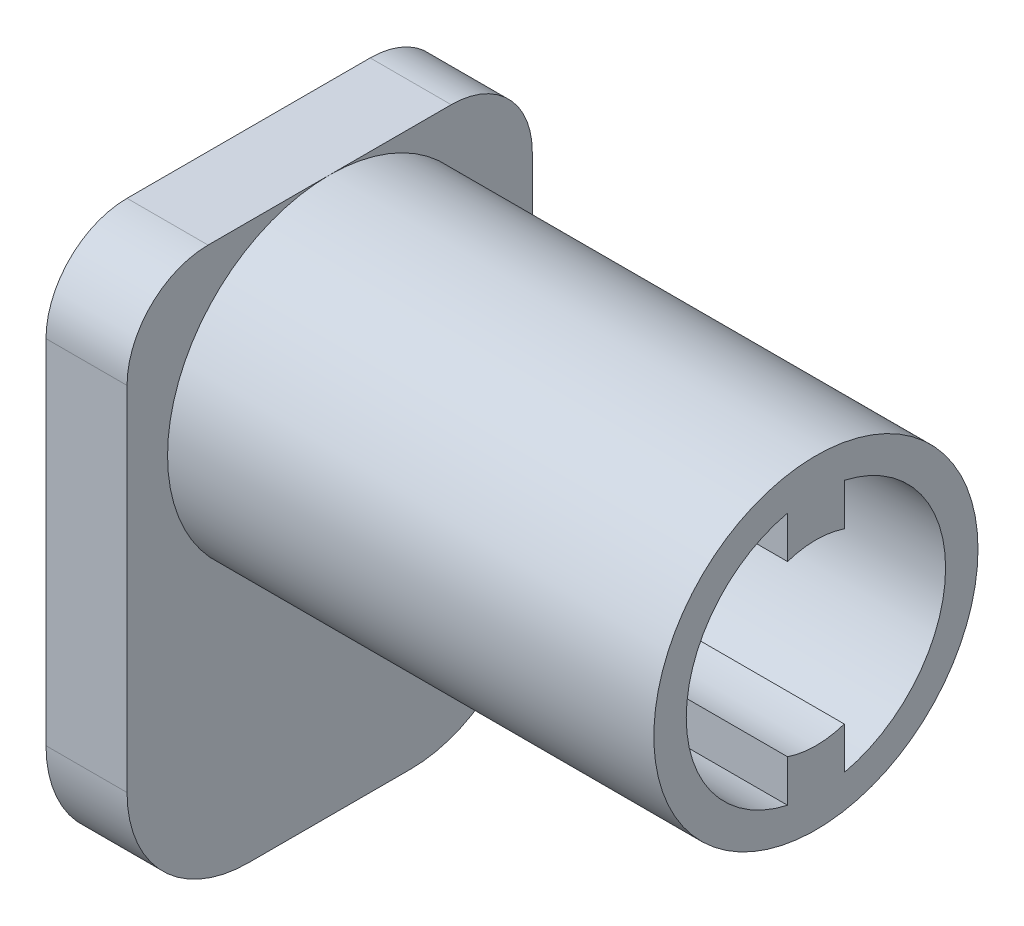
ISO-10303-21;
HEADER;
FILE_DESCRIPTION(('STEP AP214'),'2;1');
FILE_NAME('part.step','',(''),(''),'','','');
FILE_SCHEMA(('AUTOMOTIVE_DESIGN { 1 0 10303 214 1 1 1 1 }'));
ENDSEC;
DATA;
#1=APPLICATION_CONTEXT('core data for automotive mechanical design processes');
#2=APPLICATION_PROTOCOL_DEFINITION('international standard','automotive_design',2000,#1);
#3=PRODUCT_CONTEXT('',#1,'mechanical');
#4=PRODUCT('Part','Part','',(#3));
#5=PRODUCT_RELATED_PRODUCT_CATEGORY('part','',(#4));
#6=PRODUCT_DEFINITION_FORMATION('','',#4);
#7=PRODUCT_DEFINITION_CONTEXT('part definition',#1,'design');
#8=PRODUCT_DEFINITION('design','',#6,#7);
#9=PRODUCT_DEFINITION_SHAPE('','',#8);
#10=(LENGTH_UNIT() NAMED_UNIT(*) SI_UNIT(.MILLI.,.METRE.));
#11=(NAMED_UNIT(*) PLANE_ANGLE_UNIT() SI_UNIT($,.RADIAN.));
#12=(NAMED_UNIT(*) SI_UNIT($,.STERADIAN.) SOLID_ANGLE_UNIT());
#13=UNCERTAINTY_MEASURE_WITH_UNIT(LENGTH_MEASURE(1.E-05),#10,'distance_accuracy_value','');
#14=(GEOMETRIC_REPRESENTATION_CONTEXT(3) GLOBAL_UNCERTAINTY_ASSIGNED_CONTEXT((#13)) GLOBAL_UNIT_ASSIGNED_CONTEXT((#10,
#11,#12)) REPRESENTATION_CONTEXT('',''));
#15=CARTESIAN_POINT('',(0.,0.,0.));
#16=DIRECTION('',(0.,0.,1.));
#17=DIRECTION('',(1.,0.,0.));
#18=AXIS2_PLACEMENT_3D('',#15,#16,#17);
#19=CARTESIAN_POINT('',(-21.0509667991878,0.,0.));
#20=DIRECTION('',(1.,0.,0.));
#21=DIRECTION('',(0.,0.,-1.));
#22=AXIS2_PLACEMENT_3D('',#19,#20,#21);
#23=CYLINDRICAL_SURFACE('',#22,3.2);
#24=CARTESIAN_POINT('',(-12.,0.,0.));
#25=DIRECTION('',(-1.,0.,0.));
#26=DIRECTION('',(0.,0.,1.));
#27=AXIS2_PLACEMENT_3D('',#24,#25,#26);
#28=CIRCLE('',#27,3.2);
#29=CARTESIAN_POINT('',(-12.,3.1224989991992,0.7));
#30=VERTEX_POINT('',#29);
#31=CARTESIAN_POINT('',(-12.,-3.1224989991992,0.699999999999999));
#32=VERTEX_POINT('',#31);
#33=EDGE_CURVE('E165',#30,#32,#28,.F.);
#34=ORIENTED_EDGE('',*,*,#33,.F.);
#35=DIRECTION('',(-1.,0.,0.));
#36=VECTOR('',#35,1.);
#37=CARTESIAN_POINT('',(1.78934113199438,3.1224989991992,0.7));
#38=LINE('',#37,#36);
#39=CARTESIAN_POINT('',(0.,3.1224989991992,0.7));
#40=VERTEX_POINT('',#39);
#41=EDGE_CURVE('E152',#40,#30,#38,.T.);
#42=ORIENTED_EDGE('',*,*,#41,.F.);
#43=CARTESIAN_POINT('',(0.,0.,0.));
#44=DIRECTION('',(1.,0.,0.));
#45=DIRECTION('',(0.,0.,-1.));
#46=AXIS2_PLACEMENT_3D('',#43,#44,#45);
#47=CIRCLE('',#46,3.2);
#48=CARTESIAN_POINT('',(0.,-3.1224989991992,0.7));
#49=VERTEX_POINT('',#48);
#50=EDGE_CURVE('E163',#40,#49,#47,.T.);
#51=ORIENTED_EDGE('',*,*,#50,.T.);
#52=DIRECTION('',(-1.,0.,0.));
#53=VECTOR('',#52,1.);
#54=CARTESIAN_POINT('',(1.78934113199438,-3.1224989991992,0.7));
#55=LINE('',#54,#53);
#56=EDGE_CURVE('E338',#49,#32,#55,.T.);
#57=ORIENTED_EDGE('',*,*,#56,.T.);
#58=EDGE_LOOP('',(#34,#42,#51,#57));
#59=FACE_BOUND('',#58,.T.);
#60=ADVANCED_FACE('F31',(#59),#23,.F.);
#61=CARTESIAN_POINT('',(-12.,0.,0.));
#62=DIRECTION('',(1.,0.,0.));
#63=DIRECTION('',(0.,0.,-1.));
#64=AXIS2_PLACEMENT_3D('',#61,#62,#63);
#65=CYLINDRICAL_SURFACE('',#64,4.);
#66=CARTESIAN_POINT('',(-12.,0.,0.));
#67=DIRECTION('',(1.,0.,0.));
#68=DIRECTION('',(0.,0.,-1.));
#69=AXIS2_PLACEMENT_3D('',#66,#67,#68);
#70=CIRCLE('',#69,4.);
#71=CARTESIAN_POINT('',(-12.,4.,0.));
#72=VERTEX_POINT('',#71);
#73=EDGE_CURVE('E207',#72,#72,#70,.T.);
#74=ORIENTED_EDGE('',*,*,#73,.T.);
#75=EDGE_LOOP('',(#74));
#76=FACE_BOUND('',#75,.T.);
#77=CARTESIAN_POINT('',(0.,0.,0.));
#78=DIRECTION('',(1.,0.,0.));
#79=DIRECTION('',(0.,0.,-1.));
#80=AXIS2_PLACEMENT_3D('',#77,#78,#79);
#81=CIRCLE('',#80,4.);
#82=CARTESIAN_POINT('',(0.,0.,-4.));
#83=VERTEX_POINT('',#82);
#84=EDGE_CURVE('E198',#83,#83,#81,.T.);
#85=ORIENTED_EDGE('',*,*,#84,.F.);
#86=EDGE_LOOP('',(#85));
#87=FACE_BOUND('',#86,.T.);
#88=ADVANCED_FACE('F278',(#76,#87),#65,.T.);
#89=CARTESIAN_POINT('',(0.,0.,0.));
#90=DIRECTION('',(1.,0.,0.));
#91=DIRECTION('',(0.,0.,-1.));
#92=AXIS2_PLACEMENT_3D('',#89,#90,#91);
#93=PLANE('',#92);
#94=CARTESIAN_POINT('',(0.,-3.1224989991992,-0.700000000000001));
#95=VERTEX_POINT('',#94);
#96=CARTESIAN_POINT('',(0.,3.1224989991992,-0.700000000000001));
#97=VERTEX_POINT('',#96);
#98=EDGE_CURVE('E174',#95,#97,#47,.T.);
#99=ORIENTED_EDGE('',*,*,#98,.F.);
#100=DIRECTION('',(0.,-1.,0.));
#101=VECTOR('',#100,1.);
#102=CARTESIAN_POINT('',(0.,-2.86181760425084,-0.700000000000001));
#103=LINE('',#102,#101);
#104=CARTESIAN_POINT('',(0.,-2.08566536146142,-0.700000000000001));
#105=VERTEX_POINT('',#104);
#106=EDGE_CURVE('E312',#105,#95,#103,.T.);
#107=ORIENTED_EDGE('',*,*,#106,.F.);
#108=CARTESIAN_POINT('',(0.,0.,0.));
#109=DIRECTION('',(1.,0.,0.));
#110=DIRECTION('',(0.,0.,-1.));
#111=AXIS2_PLACEMENT_3D('',#108,#109,#110);
#112=CIRCLE('',#111,2.2);
#113=CARTESIAN_POINT('',(0.,-2.08566536146142,0.7));
#114=VERTEX_POINT('',#113);
#115=EDGE_CURVE('E333',#114,#105,#112,.T.);
#116=ORIENTED_EDGE('',*,*,#115,.F.);
#117=DIRECTION('',(0.,1.,0.));
#118=VECTOR('',#117,1.);
#119=CARTESIAN_POINT('',(0.,-2.86181760425084,0.699999999999999));
#120=LINE('',#119,#118);
#121=EDGE_CURVE('E172',#49,#114,#120,.T.);
#122=ORIENTED_EDGE('',*,*,#121,.F.);
#123=ORIENTED_EDGE('',*,*,#50,.F.);
#124=DIRECTION('',(0.,1.,0.));
#125=VECTOR('',#124,1.);
#126=CARTESIAN_POINT('',(0.,2.86181760425084,0.7));
#127=LINE('',#126,#125);
#128=CARTESIAN_POINT('',(0.,2.08566536146142,0.699999999999999));
#129=VERTEX_POINT('',#128);
#130=EDGE_CURVE('E149',#129,#40,#127,.T.);
#131=ORIENTED_EDGE('',*,*,#130,.F.);
#132=CARTESIAN_POINT('',(0.,0.,0.));
#133=DIRECTION('',(1.,0.,0.));
#134=DIRECTION('',(0.,0.,-1.));
#135=AXIS2_PLACEMENT_3D('',#132,#133,#134);
#136=CIRCLE('',#135,2.2);
#137=CARTESIAN_POINT('',(0.,2.08566536146142,-0.700000000000001));
#138=VERTEX_POINT('',#137);
#139=EDGE_CURVE('E316',#138,#129,#136,.T.);
#140=ORIENTED_EDGE('',*,*,#139,.F.);
#141=DIRECTION('',(0.,-1.,0.));
#142=VECTOR('',#141,1.);
#143=CARTESIAN_POINT('',(0.,2.08566536146142,-0.700000000000001));
#144=LINE('',#143,#142);
#145=EDGE_CURVE('E315',#97,#138,#144,.T.);
#146=ORIENTED_EDGE('',*,*,#145,.F.);
#147=EDGE_LOOP('',(#99,#107,#116,#122,#123,#131,#140,#146));
#148=FACE_BOUND('',#147,.T.);
#149=ORIENTED_EDGE('',*,*,#84,.T.);
#150=EDGE_LOOP('',(#149));
#151=FACE_BOUND('',#150,.T.);
#152=ADVANCED_FACE('F169',(#148,#151),#93,.T.);
#153=CARTESIAN_POINT('',(-14.,4.,-5.));
#154=DIRECTION('',(0.,0.,1.));
#155=DIRECTION('',(0.,-1.,0.));
#156=AXIS2_PLACEMENT_3D('',#153,#154,#155);
#157=PLANE('',#156);
#158=DIRECTION('',(0.,-1.,0.));
#159=VECTOR('',#158,1.);
#160=CARTESIAN_POINT('',(-12.,4.,-5.));
#161=LINE('',#160,#159);
#162=CARTESIAN_POINT('',(-12.,2.,-5.));
#163=VERTEX_POINT('',#162);
#164=CARTESIAN_POINT('',(-12.,-6.69999999999999,-5.));
#165=VERTEX_POINT('',#164);
#166=EDGE_CURVE('E187',#163,#165,#161,.T.);
#167=ORIENTED_EDGE('',*,*,#166,.T.);
#168=DIRECTION('',(1.,0.,0.));
#169=VECTOR('',#168,1.);
#170=CARTESIAN_POINT('',(-14.,-6.7,-5.));
#171=LINE('',#170,#169);
#172=CARTESIAN_POINT('',(-14.,-6.69999999999999,-5.));
#173=VERTEX_POINT('',#172);
#174=EDGE_CURVE('E54',#165,#173,#171,.F.);
#175=ORIENTED_EDGE('',*,*,#174,.T.);
#176=DIRECTION('',(0.,-1.,0.));
#177=VECTOR('',#176,1.);
#178=CARTESIAN_POINT('',(-14.,4.,-5.));
#179=LINE('',#178,#177);
#180=CARTESIAN_POINT('',(-14.,2.,-5.));
#181=VERTEX_POINT('',#180);
#182=EDGE_CURVE('E188',#181,#173,#179,.T.);
#183=ORIENTED_EDGE('',*,*,#182,.F.);
#184=DIRECTION('',(1.,0.,0.));
#185=VECTOR('',#184,1.);
#186=CARTESIAN_POINT('',(-14.,2.,-5.));
#187=LINE('',#186,#185);
#188=EDGE_CURVE('E235',#181,#163,#187,.T.);
#189=ORIENTED_EDGE('',*,*,#188,.T.);
#190=EDGE_LOOP('',(#167,#175,#183,#189));
#191=FACE_BOUND('',#190,.T.);
#192=ADVANCED_FACE('F261',(#191),#157,.F.);
#193=CARTESIAN_POINT('',(-14.,-9.7,-5.));
#194=DIRECTION('',(0.,1.,0.));
#195=DIRECTION('',(0.,0.,1.));
#196=AXIS2_PLACEMENT_3D('',#193,#194,#195);
#197=PLANE('',#196);
#198=DIRECTION('',(0.,0.,1.));
#199=VECTOR('',#198,1.);
#200=CARTESIAN_POINT('',(-14.,-9.7,-5.));
#201=LINE('',#200,#199);
#202=CARTESIAN_POINT('',(-14.,-9.7,-2.));
#203=VERTEX_POINT('',#202);
#204=CARTESIAN_POINT('',(-14.,-9.7,2.));
#205=VERTEX_POINT('',#204);
#206=EDGE_CURVE('E190',#203,#205,#201,.T.);
#207=ORIENTED_EDGE('',*,*,#206,.F.);
#208=DIRECTION('',(1.,0.,0.));
#209=VECTOR('',#208,1.);
#210=CARTESIAN_POINT('',(-14.,-9.7,-2.));
#211=LINE('',#210,#209);
#212=CARTESIAN_POINT('',(-12.,-9.7,-2.));
#213=VERTEX_POINT('',#212);
#214=EDGE_CURVE('E240',#203,#213,#211,.T.);
#215=ORIENTED_EDGE('',*,*,#214,.T.);
#216=DIRECTION('',(0.,0.,1.));
#217=VECTOR('',#216,1.);
#218=CARTESIAN_POINT('',(-12.,-9.7,-5.));
#219=LINE('',#218,#217);
#220=CARTESIAN_POINT('',(-12.,-9.7,2.));
#221=VERTEX_POINT('',#220);
#222=EDGE_CURVE('E200',#213,#221,#219,.T.);
#223=ORIENTED_EDGE('',*,*,#222,.T.);
#224=DIRECTION('',(1.,0.,0.));
#225=VECTOR('',#224,1.);
#226=CARTESIAN_POINT('',(-14.,-9.7,2.));
#227=LINE('',#226,#225);
#228=EDGE_CURVE('E238',#221,#205,#227,.F.);
#229=ORIENTED_EDGE('',*,*,#228,.T.);
#230=EDGE_LOOP('',(#207,#215,#223,#229));
#231=FACE_BOUND('',#230,.T.);
#232=ADVANCED_FACE('F254',(#231),#197,.F.);
#233=CARTESIAN_POINT('',(-14.,4.,5.));
#234=DIRECTION('',(0.,0.,-1.));
#235=DIRECTION('',(0.,1.,0.));
#236=AXIS2_PLACEMENT_3D('',#233,#234,#235);
#237=PLANE('',#236);
#238=DIRECTION('',(0.,1.,0.));
#239=VECTOR('',#238,1.);
#240=CARTESIAN_POINT('',(-14.,4.,5.));
#241=LINE('',#240,#239);
#242=CARTESIAN_POINT('',(-14.,-6.7,5.));
#243=VERTEX_POINT('',#242);
#244=CARTESIAN_POINT('',(-14.,2.,5.));
#245=VERTEX_POINT('',#244);
#246=EDGE_CURVE('E193',#243,#245,#241,.T.);
#247=ORIENTED_EDGE('',*,*,#246,.F.);
#248=DIRECTION('',(1.,0.,0.));
#249=VECTOR('',#248,1.);
#250=CARTESIAN_POINT('',(-14.,-6.7,5.));
#251=LINE('',#250,#249);
#252=CARTESIAN_POINT('',(-12.,-6.7,5.));
#253=VERTEX_POINT('',#252);
#254=EDGE_CURVE('E11',#243,#253,#251,.T.);
#255=ORIENTED_EDGE('',*,*,#254,.T.);
#256=DIRECTION('',(0.,1.,0.));
#257=VECTOR('',#256,1.);
#258=CARTESIAN_POINT('',(-12.,4.,5.));
#259=LINE('',#258,#257);
#260=CARTESIAN_POINT('',(-12.,2.,5.));
#261=VERTEX_POINT('',#260);
#262=EDGE_CURVE('E203',#253,#261,#259,.T.);
#263=ORIENTED_EDGE('',*,*,#262,.T.);
#264=DIRECTION('',(1.,0.,0.));
#265=VECTOR('',#264,1.);
#266=CARTESIAN_POINT('',(-14.,2.,5.));
#267=LINE('',#266,#265);
#268=EDGE_CURVE('E228',#261,#245,#267,.F.);
#269=ORIENTED_EDGE('',*,*,#268,.T.);
#270=EDGE_LOOP('',(#247,#255,#263,#269));
#271=FACE_BOUND('',#270,.T.);
#272=ADVANCED_FACE('F361',(#271),#237,.F.);
#273=CARTESIAN_POINT('',(-14.,4.,-5.));
#274=DIRECTION('',(0.,-1.,0.));
#275=DIRECTION('',(0.,0.,-1.));
#276=AXIS2_PLACEMENT_3D('',#273,#274,#275);
#277=PLANE('',#276);
#278=DIRECTION('',(0.,0.,-1.));
#279=VECTOR('',#278,1.);
#280=CARTESIAN_POINT('',(-14.,4.,-5.));
#281=LINE('',#280,#279);
#282=CARTESIAN_POINT('',(-14.,4.,3.));
#283=VERTEX_POINT('',#282);
#284=CARTESIAN_POINT('',(-14.,4.,-3.));
#285=VERTEX_POINT('',#284);
#286=EDGE_CURVE('E195',#283,#285,#281,.T.);
#287=ORIENTED_EDGE('',*,*,#286,.F.);
#288=DIRECTION('',(1.,0.,0.));
#289=VECTOR('',#288,1.);
#290=CARTESIAN_POINT('',(-14.,4.,3.));
#291=LINE('',#290,#289);
#292=CARTESIAN_POINT('',(-12.,4.,3.));
#293=VERTEX_POINT('',#292);
#294=EDGE_CURVE('E220',#283,#293,#291,.T.);
#295=ORIENTED_EDGE('',*,*,#294,.T.);
#296=DIRECTION('',(0.,0.,-1.));
#297=VECTOR('',#296,1.);
#298=CARTESIAN_POINT('',(-12.,4.,-5.));
#299=LINE('',#298,#297);
#300=EDGE_CURVE('E191',#293,#72,#299,.T.);
#301=ORIENTED_EDGE('',*,*,#300,.T.);
#302=CARTESIAN_POINT('',(-12.,4.,-3.));
#303=VERTEX_POINT('',#302);
#304=EDGE_CURVE('E205',#72,#303,#299,.T.);
#305=ORIENTED_EDGE('',*,*,#304,.T.);
#306=DIRECTION('',(1.,0.,0.));
#307=VECTOR('',#306,1.);
#308=CARTESIAN_POINT('',(-14.,4.,-3.));
#309=LINE('',#308,#307);
#310=EDGE_CURVE('E218',#303,#285,#309,.F.);
#311=ORIENTED_EDGE('',*,*,#310,.T.);
#312=EDGE_LOOP('',(#287,#295,#301,#305,#311));
#313=FACE_BOUND('',#312,.T.);
#314=ADVANCED_FACE('F272',(#313),#277,.F.);
#315=CARTESIAN_POINT('',(-14.,-9.7,-5.));
#316=DIRECTION('',(-1.,0.,0.));
#317=DIRECTION('',(0.,0.,1.));
#318=AXIS2_PLACEMENT_3D('',#315,#316,#317);
#319=PLANE('',#318);
#320=CARTESIAN_POINT('',(-14.,0.,0.));
#321=DIRECTION('',(-1.,0.,0.));
#322=DIRECTION('',(0.,0.,1.));
#323=AXIS2_PLACEMENT_3D('',#320,#321,#322);
#324=CIRCLE('',#323,1.6);
#325=CARTESIAN_POINT('',(-14.,0.,1.6));
#326=VERTEX_POINT('',#325);
#327=EDGE_CURVE('E179',#326,#326,#324,.T.);
#328=ORIENTED_EDGE('',*,*,#327,.F.);
#329=EDGE_LOOP('',(#328));
#330=FACE_BOUND('',#329,.T.);
#331=ORIENTED_EDGE('',*,*,#182,.T.);
#332=CARTESIAN_POINT('',(-14.,-6.7,-2.));
#333=DIRECTION('',(-1.,0.,0.));
#334=DIRECTION('',(0.,0.,1.));
#335=AXIS2_PLACEMENT_3D('',#332,#333,#334);
#336=CIRCLE('',#335,3.);
#337=EDGE_CURVE('E39',#173,#203,#336,.T.);
#338=ORIENTED_EDGE('',*,*,#337,.T.);
#339=ORIENTED_EDGE('',*,*,#206,.T.);
#340=CARTESIAN_POINT('',(-14.,-6.7,2.));
#341=DIRECTION('',(-1.,0.,0.));
#342=DIRECTION('',(0.,0.,1.));
#343=AXIS2_PLACEMENT_3D('',#340,#341,#342);
#344=CIRCLE('',#343,3.);
#345=EDGE_CURVE('E46',#205,#243,#344,.T.);
#346=ORIENTED_EDGE('',*,*,#345,.T.);
#347=ORIENTED_EDGE('',*,*,#246,.T.);
#348=CARTESIAN_POINT('',(-14.,2.,3.));
#349=DIRECTION('',(-1.,0.,0.));
#350=DIRECTION('',(0.,0.,1.));
#351=AXIS2_PLACEMENT_3D('',#348,#349,#350);
#352=CIRCLE('',#351,2.);
#353=EDGE_CURVE('E233',#245,#283,#352,.T.);
#354=ORIENTED_EDGE('',*,*,#353,.T.);
#355=ORIENTED_EDGE('',*,*,#286,.T.);
#356=CARTESIAN_POINT('',(-14.,2.,-3.));
#357=DIRECTION('',(-1.,0.,0.));
#358=DIRECTION('',(0.,0.,1.));
#359=AXIS2_PLACEMENT_3D('',#356,#357,#358);
#360=CIRCLE('',#359,2.);
#361=EDGE_CURVE('E231',#285,#181,#360,.T.);
#362=ORIENTED_EDGE('',*,*,#361,.T.);
#363=EDGE_LOOP('',(#331,#338,#339,#346,#347,#354,#355,#362));
#364=FACE_BOUND('',#363,.T.);
#365=ADVANCED_FACE('F250',(#330,#364),#319,.T.);
#366=CARTESIAN_POINT('',(-12.,-9.7,-5.));
#367=DIRECTION('',(-1.,0.,0.));
#368=DIRECTION('',(0.,0.,1.));
#369=AXIS2_PLACEMENT_3D('',#366,#367,#368);
#370=PLANE('',#369);
#371=ORIENTED_EDGE('',*,*,#222,.F.);
#372=CARTESIAN_POINT('',(-12.,-6.7,-2.));
#373=DIRECTION('',(-1.,0.,0.));
#374=DIRECTION('',(0.,0.,1.));
#375=AXIS2_PLACEMENT_3D('',#372,#373,#374);
#376=CIRCLE('',#375,3.);
#377=EDGE_CURVE('E245',#213,#165,#376,.F.);
#378=ORIENTED_EDGE('',*,*,#377,.T.);
#379=ORIENTED_EDGE('',*,*,#166,.F.);
#380=CARTESIAN_POINT('',(-12.,2.,-3.));
#381=DIRECTION('',(-1.,0.,0.));
#382=DIRECTION('',(0.,0.,1.));
#383=AXIS2_PLACEMENT_3D('',#380,#381,#382);
#384=CIRCLE('',#383,2.);
#385=EDGE_CURVE('E223',#163,#303,#384,.F.);
#386=ORIENTED_EDGE('',*,*,#385,.T.);
#387=ORIENTED_EDGE('',*,*,#304,.F.);
#388=ORIENTED_EDGE('',*,*,#73,.F.);
#389=ORIENTED_EDGE('',*,*,#300,.F.);
#390=CARTESIAN_POINT('',(-12.,2.,3.));
#391=DIRECTION('',(-1.,0.,0.));
#392=DIRECTION('',(0.,0.,1.));
#393=AXIS2_PLACEMENT_3D('',#390,#391,#392);
#394=CIRCLE('',#393,2.);
#395=EDGE_CURVE('E225',#293,#261,#394,.F.);
#396=ORIENTED_EDGE('',*,*,#395,.T.);
#397=ORIENTED_EDGE('',*,*,#262,.F.);
#398=CARTESIAN_POINT('',(-12.,-6.7,2.));
#399=DIRECTION('',(-1.,0.,0.));
#400=DIRECTION('',(0.,0.,1.));
#401=AXIS2_PLACEMENT_3D('',#398,#399,#400);
#402=CIRCLE('',#401,3.);
#403=EDGE_CURVE('E243',#253,#221,#402,.F.);
#404=ORIENTED_EDGE('',*,*,#403,.T.);
#405=EDGE_LOOP('',(#371,#378,#379,#386,#387,#388,#389,#396,#397,#404));
#406=FACE_BOUND('',#405,.T.);
#407=ADVANCED_FACE('F260',(#406),#370,.F.);
#408=CARTESIAN_POINT('',(-12.,-9.7,-5.));
#409=DIRECTION('',(-1.,0.,0.));
#410=DIRECTION('',(0.,0.,1.));
#411=AXIS2_PLACEMENT_3D('',#408,#409,#410);
#412=PLANE('',#411);
#413=CARTESIAN_POINT('',(-12.,0.,0.));
#414=DIRECTION('',(-1.,0.,0.));
#415=DIRECTION('',(0.,0.,1.));
#416=AXIS2_PLACEMENT_3D('',#413,#414,#415);
#417=CIRCLE('',#416,1.6);
#418=CARTESIAN_POINT('',(-12.,0.,1.6));
#419=VERTEX_POINT('',#418);
#420=EDGE_CURVE('E175',#419,#419,#417,.T.);
#421=ORIENTED_EDGE('',*,*,#420,.T.);
#422=EDGE_LOOP('',(#421));
#423=FACE_BOUND('',#422,.T.);
#424=CARTESIAN_POINT('',(-12.,0.,0.));
#425=DIRECTION('',(-1.,0.,0.));
#426=DIRECTION('',(0.,0.,1.));
#427=AXIS2_PLACEMENT_3D('',#424,#425,#426);
#428=CIRCLE('',#427,2.2);
#429=CARTESIAN_POINT('',(-12.,2.08566536146142,-0.700000000000001));
#430=VERTEX_POINT('',#429);
#431=CARTESIAN_POINT('',(-12.,2.08566536146142,0.7));
#432=VERTEX_POINT('',#431);
#433=EDGE_CURVE('E215',#430,#432,#428,.F.);
#434=ORIENTED_EDGE('',*,*,#433,.T.);
#435=DIRECTION('',(0.,1.,0.));
#436=VECTOR('',#435,1.);
#437=CARTESIAN_POINT('',(-12.,-9.7,0.699999999999989));
#438=LINE('',#437,#436);
#439=EDGE_CURVE('E330',#432,#30,#438,.T.);
#440=ORIENTED_EDGE('',*,*,#439,.T.);
#441=ORIENTED_EDGE('',*,*,#33,.T.);
#442=DIRECTION('',(0.,1.,0.));
#443=VECTOR('',#442,1.);
#444=CARTESIAN_POINT('',(-12.,-9.7,0.699999999999997));
#445=LINE('',#444,#443);
#446=CARTESIAN_POINT('',(-12.,-2.08566536146142,0.7));
#447=VERTEX_POINT('',#446);
#448=EDGE_CURVE('E345',#32,#447,#445,.T.);
#449=ORIENTED_EDGE('',*,*,#448,.T.);
#450=CARTESIAN_POINT('',(-12.,0.,0.));
#451=DIRECTION('',(-1.,0.,0.));
#452=DIRECTION('',(0.,0.,1.));
#453=AXIS2_PLACEMENT_3D('',#450,#451,#452);
#454=CIRCLE('',#453,2.2);
#455=CARTESIAN_POINT('',(-12.,-2.08566536146142,-0.700000000000001));
#456=VERTEX_POINT('',#455);
#457=EDGE_CURVE('E210',#447,#456,#454,.F.);
#458=ORIENTED_EDGE('',*,*,#457,.T.);
#459=DIRECTION('',(0.,-1.,0.));
#460=VECTOR('',#459,1.);
#461=CARTESIAN_POINT('',(-12.,-9.7,-0.700000000000001));
#462=LINE('',#461,#460);
#463=CARTESIAN_POINT('',(-12.,-3.1224989991992,-0.700000000000001));
#464=VERTEX_POINT('',#463);
#465=EDGE_CURVE('E347',#456,#464,#462,.T.);
#466=ORIENTED_EDGE('',*,*,#465,.T.);
#467=CARTESIAN_POINT('',(-12.,3.1224989991992,-0.7));
#468=VERTEX_POINT('',#467);
#469=EDGE_CURVE('E184',#464,#468,#28,.F.);
#470=ORIENTED_EDGE('',*,*,#469,.T.);
#471=DIRECTION('',(0.,-1.,0.));
#472=VECTOR('',#471,1.);
#473=CARTESIAN_POINT('',(-12.,-9.7,-0.700000000000006));
#474=LINE('',#473,#472);
#475=EDGE_CURVE('E324',#468,#430,#474,.T.);
#476=ORIENTED_EDGE('',*,*,#475,.T.);
#477=EDGE_LOOP('',(#434,#440,#441,#449,#458,#466,#470,#476));
#478=FACE_BOUND('',#477,.T.);
#479=ADVANCED_FACE('F298',(#423,#478),#412,.F.);
#480=ORIENTED_EDGE('',*,*,#98,.T.);
#481=DIRECTION('',(-1.,0.,0.));
#482=VECTOR('',#481,1.);
#483=CARTESIAN_POINT('',(1.78934113199438,3.1224989991992,-0.700000000000001));
#484=LINE('',#483,#482);
#485=EDGE_CURVE('E166',#97,#468,#484,.T.);
#486=ORIENTED_EDGE('',*,*,#485,.T.);
#487=ORIENTED_EDGE('',*,*,#469,.F.);
#488=DIRECTION('',(-1.,0.,0.));
#489=VECTOR('',#488,1.);
#490=CARTESIAN_POINT('',(1.78934113199438,-3.1224989991992,-0.700000000000001));
#491=LINE('',#490,#489);
#492=EDGE_CURVE('E311',#95,#464,#491,.T.);
#493=ORIENTED_EDGE('',*,*,#492,.F.);
#494=EDGE_LOOP('',(#480,#486,#487,#493));
#495=FACE_BOUND('',#494,.T.);
#496=ADVANCED_FACE('F291',(#495),#23,.F.);
#497=CARTESIAN_POINT('',(0.,0.,0.));
#498=DIRECTION('',(-1.,0.,0.));
#499=DIRECTION('',(0.,0.,1.));
#500=AXIS2_PLACEMENT_3D('',#497,#498,#499);
#501=CYLINDRICAL_SURFACE('',#500,1.6);
#502=ORIENTED_EDGE('',*,*,#327,.T.);
#503=EDGE_LOOP('',(#502));
#504=FACE_BOUND('',#503,.T.);
#505=ORIENTED_EDGE('',*,*,#420,.F.);
#506=EDGE_LOOP('',(#505));
#507=FACE_BOUND('',#506,.T.);
#508=ADVANCED_FACE('F297',(#504,#507),#501,.F.);
#509=CARTESIAN_POINT('',(1.78934113199438,0.,0.));
#510=DIRECTION('',(-1.,0.,0.));
#511=DIRECTION('',(0.,0.,1.));
#512=AXIS2_PLACEMENT_3D('',#509,#510,#511);
#513=CYLINDRICAL_SURFACE('',#512,2.2);
#514=ORIENTED_EDGE('',*,*,#457,.F.);
#515=DIRECTION('',(-1.,0.,0.));
#516=VECTOR('',#515,1.);
#517=CARTESIAN_POINT('',(1.78934113199438,-2.08566536146142,0.7));
#518=LINE('',#517,#516);
#519=EDGE_CURVE('E336',#114,#447,#518,.T.);
#520=ORIENTED_EDGE('',*,*,#519,.F.);
#521=ORIENTED_EDGE('',*,*,#115,.T.);
#522=DIRECTION('',(-1.,0.,0.));
#523=VECTOR('',#522,1.);
#524=CARTESIAN_POINT('',(1.78934113199438,-2.08566536146142,-0.700000000000001));
#525=LINE('',#524,#523);
#526=EDGE_CURVE('E335',#105,#456,#525,.T.);
#527=ORIENTED_EDGE('',*,*,#526,.T.);
#528=EDGE_LOOP('',(#514,#520,#521,#527));
#529=FACE_BOUND('',#528,.T.);
#530=ADVANCED_FACE('F304',(#529),#513,.F.);
#531=CARTESIAN_POINT('',(1.78934113199438,-2.86181760425084,-0.700000000000001));
#532=DIRECTION('',(0.,0.,-1.));
#533=DIRECTION('',(-1.,0.,0.));
#534=AXIS2_PLACEMENT_3D('',#531,#532,#533);
#535=PLANE('',#534);
#536=ORIENTED_EDGE('',*,*,#465,.F.);
#537=ORIENTED_EDGE('',*,*,#526,.F.);
#538=ORIENTED_EDGE('',*,*,#106,.T.);
#539=ORIENTED_EDGE('',*,*,#492,.T.);
#540=EDGE_LOOP('',(#536,#537,#538,#539));
#541=FACE_BOUND('',#540,.T.);
#542=ADVANCED_FACE('F460',(#541),#535,.T.);
#543=CARTESIAN_POINT('',(1.78934113199438,-2.86181760425084,0.699999999999999));
#544=DIRECTION('',(0.,0.,1.));
#545=DIRECTION('',(0.,-1.,0.));
#546=AXIS2_PLACEMENT_3D('',#543,#544,#545);
#547=PLANE('',#546);
#548=ORIENTED_EDGE('',*,*,#448,.F.);
#549=ORIENTED_EDGE('',*,*,#56,.F.);
#550=ORIENTED_EDGE('',*,*,#121,.T.);
#551=ORIENTED_EDGE('',*,*,#519,.T.);
#552=EDGE_LOOP('',(#548,#549,#550,#551));
#553=FACE_BOUND('',#552,.T.);
#554=ADVANCED_FACE('F471',(#553),#547,.T.);
#555=CARTESIAN_POINT('',(1.78934113199438,0.,0.));
#556=DIRECTION('',(-1.,0.,0.));
#557=DIRECTION('',(0.,0.,1.));
#558=AXIS2_PLACEMENT_3D('',#555,#556,#557);
#559=CYLINDRICAL_SURFACE('',#558,2.2);
#560=ORIENTED_EDGE('',*,*,#433,.F.);
#561=DIRECTION('',(-1.,0.,0.));
#562=VECTOR('',#561,1.);
#563=CARTESIAN_POINT('',(1.78934113199438,2.08566536146142,-0.700000000000001));
#564=LINE('',#563,#562);
#565=EDGE_CURVE('E320',#138,#430,#564,.T.);
#566=ORIENTED_EDGE('',*,*,#565,.F.);
#567=ORIENTED_EDGE('',*,*,#139,.T.);
#568=DIRECTION('',(-1.,0.,0.));
#569=VECTOR('',#568,1.);
#570=CARTESIAN_POINT('',(1.78934113199438,2.08566536146142,0.7));
#571=LINE('',#570,#569);
#572=EDGE_CURVE('E155',#129,#432,#571,.T.);
#573=ORIENTED_EDGE('',*,*,#572,.T.);
#574=EDGE_LOOP('',(#560,#566,#567,#573));
#575=FACE_BOUND('',#574,.T.);
#576=ADVANCED_FACE('F482',(#575),#559,.F.);
#577=CARTESIAN_POINT('',(1.78934113199438,2.86181760425084,0.7));
#578=DIRECTION('',(0.,0.,1.));
#579=DIRECTION('',(0.,-1.,0.));
#580=AXIS2_PLACEMENT_3D('',#577,#578,#579);
#581=PLANE('',#580);
#582=ORIENTED_EDGE('',*,*,#439,.F.);
#583=ORIENTED_EDGE('',*,*,#572,.F.);
#584=ORIENTED_EDGE('',*,*,#130,.T.);
#585=ORIENTED_EDGE('',*,*,#41,.T.);
#586=EDGE_LOOP('',(#582,#583,#584,#585));
#587=FACE_BOUND('',#586,.T.);
#588=ADVANCED_FACE('F151',(#587),#581,.T.);
#589=CARTESIAN_POINT('',(1.78934113199438,2.08566536146142,-0.700000000000001));
#590=DIRECTION('',(0.,0.,-1.));
#591=DIRECTION('',(0.,1.,0.));
#592=AXIS2_PLACEMENT_3D('',#589,#590,#591);
#593=PLANE('',#592);
#594=ORIENTED_EDGE('',*,*,#475,.F.);
#595=ORIENTED_EDGE('',*,*,#485,.F.);
#596=ORIENTED_EDGE('',*,*,#145,.T.);
#597=ORIENTED_EDGE('',*,*,#565,.T.);
#598=EDGE_LOOP('',(#594,#595,#596,#597));
#599=FACE_BOUND('',#598,.T.);
#600=ADVANCED_FACE('F322',(#599),#593,.T.);
#601=CARTESIAN_POINT('',(-14.,2.,3.));
#602=DIRECTION('',(1.,0.,0.));
#603=DIRECTION('',(0.,0.,-1.));
#604=AXIS2_PLACEMENT_3D('',#601,#602,#603);
#605=CYLINDRICAL_SURFACE('',#604,2.);
#606=ORIENTED_EDGE('',*,*,#353,.F.);
#607=ORIENTED_EDGE('',*,*,#268,.F.);
#608=ORIENTED_EDGE('',*,*,#395,.F.);
#609=ORIENTED_EDGE('',*,*,#294,.F.);
#610=EDGE_LOOP('',(#606,#607,#608,#609));
#611=FACE_BOUND('',#610,.T.);
#612=ADVANCED_FACE('F391',(#611),#605,.T.);
#613=CARTESIAN_POINT('',(-14.,2.,-3.));
#614=DIRECTION('',(1.,0.,0.));
#615=DIRECTION('',(0.,0.,-1.));
#616=AXIS2_PLACEMENT_3D('',#613,#614,#615);
#617=CYLINDRICAL_SURFACE('',#616,2.);
#618=ORIENTED_EDGE('',*,*,#361,.F.);
#619=ORIENTED_EDGE('',*,*,#310,.F.);
#620=ORIENTED_EDGE('',*,*,#385,.F.);
#621=ORIENTED_EDGE('',*,*,#188,.F.);
#622=EDGE_LOOP('',(#618,#619,#620,#621));
#623=FACE_BOUND('',#622,.T.);
#624=ADVANCED_FACE('F265',(#623),#617,.T.);
#625=CARTESIAN_POINT('',(-14.,-6.7,-2.));
#626=DIRECTION('',(1.,0.,0.));
#627=DIRECTION('',(0.,0.,-1.));
#628=AXIS2_PLACEMENT_3D('',#625,#626,#627);
#629=CYLINDRICAL_SURFACE('',#628,3.);
#630=ORIENTED_EDGE('',*,*,#337,.F.);
#631=ORIENTED_EDGE('',*,*,#174,.F.);
#632=ORIENTED_EDGE('',*,*,#377,.F.);
#633=ORIENTED_EDGE('',*,*,#214,.F.);
#634=EDGE_LOOP('',(#630,#631,#632,#633));
#635=FACE_BOUND('',#634,.T.);
#636=ADVANCED_FACE('F257',(#635),#629,.T.);
#637=CARTESIAN_POINT('',(-14.,-6.7,2.));
#638=DIRECTION('',(1.,0.,0.));
#639=DIRECTION('',(0.,0.,-1.));
#640=AXIS2_PLACEMENT_3D('',#637,#638,#639);
#641=CYLINDRICAL_SURFACE('',#640,3.);
#642=ORIENTED_EDGE('',*,*,#345,.F.);
#643=ORIENTED_EDGE('',*,*,#228,.F.);
#644=ORIENTED_EDGE('',*,*,#403,.F.);
#645=ORIENTED_EDGE('',*,*,#254,.F.);
#646=EDGE_LOOP('',(#642,#643,#644,#645));
#647=FACE_BOUND('',#646,.T.);
#648=ADVANCED_FACE('F33',(#647),#641,.T.);
#649=CLOSED_SHELL('',(#60,#88,#152,#192,#232,#272,#314,#365,#407,#479,#496,#508,#530,#542,#554,
#576,#588,#600,#612,#624,#636,#648));
#650=MANIFOLD_SOLID_BREP('B2',#649);
#651=ADVANCED_BREP_SHAPE_REPRESENTATION('',(#18,#650),#14);
#652=SHAPE_DEFINITION_REPRESENTATION(#9,#651);
ENDSEC;
END-ISO-10303-21;
